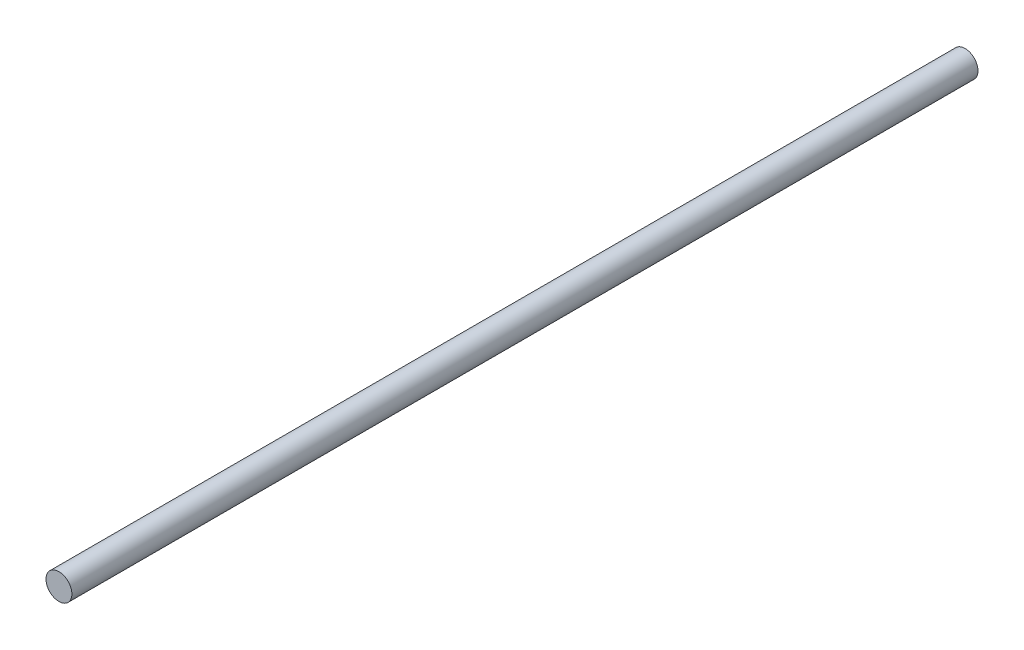
ISO-10303-21;
HEADER;
FILE_DESCRIPTION(('STEP AP214'),'2;1');
FILE_NAME('part.step','',(''),(''),'','','');
FILE_SCHEMA(('AUTOMOTIVE_DESIGN { 1 0 10303 214 1 1 1 1 }'));
ENDSEC;
DATA;
#1=APPLICATION_CONTEXT('core data for automotive mechanical design processes');
#2=APPLICATION_PROTOCOL_DEFINITION('international standard','automotive_design',2000,#1);
#3=PRODUCT_CONTEXT('',#1,'mechanical');
#4=PRODUCT('Part','Part','',(#3));
#5=PRODUCT_RELATED_PRODUCT_CATEGORY('part','',(#4));
#6=PRODUCT_DEFINITION_FORMATION('','',#4);
#7=PRODUCT_DEFINITION_CONTEXT('part definition',#1,'design');
#8=PRODUCT_DEFINITION('design','',#6,#7);
#9=PRODUCT_DEFINITION_SHAPE('','',#8);
#10=(LENGTH_UNIT() NAMED_UNIT(*) SI_UNIT(.MILLI.,.METRE.));
#11=(NAMED_UNIT(*) PLANE_ANGLE_UNIT() SI_UNIT($,.RADIAN.));
#12=(NAMED_UNIT(*) SI_UNIT($,.STERADIAN.) SOLID_ANGLE_UNIT());
#13=UNCERTAINTY_MEASURE_WITH_UNIT(LENGTH_MEASURE(1.E-05),#10,'distance_accuracy_value','');
#14=(GEOMETRIC_REPRESENTATION_CONTEXT(3) GLOBAL_UNCERTAINTY_ASSIGNED_CONTEXT((#13)) GLOBAL_UNIT_ASSIGNED_CONTEXT((#10,
#11,#12)) REPRESENTATION_CONTEXT('',''));
#15=CARTESIAN_POINT('',(0.,0.,0.));
#16=DIRECTION('',(0.,0.,1.));
#17=DIRECTION('',(1.,0.,0.));
#18=AXIS2_PLACEMENT_3D('',#15,#16,#17);
#19=CARTESIAN_POINT('',(0.,0.,140.));
#20=DIRECTION('',(0.,0.,-1.));
#21=DIRECTION('',(-1.,0.,0.));
#22=AXIS2_PLACEMENT_3D('',#19,#20,#21);
#23=CYLINDRICAL_SURFACE('',#22,2.);
#24=CARTESIAN_POINT('',(0.,0.,140.));
#25=DIRECTION('',(0.,0.,1.));
#26=DIRECTION('',(1.,0.,0.));
#27=AXIS2_PLACEMENT_3D('',#24,#25,#26);
#28=CIRCLE('',#27,2.);
#29=CARTESIAN_POINT('',(2.,0.,140.));
#30=VERTEX_POINT('',#29);
#31=EDGE_CURVE('E10',#30,#30,#28,.T.);
#32=ORIENTED_EDGE('',*,*,#31,.F.);
#33=EDGE_LOOP('',(#32));
#34=FACE_BOUND('',#33,.T.);
#35=CARTESIAN_POINT('',(0.,0.,0.));
#36=DIRECTION('',(0.,0.,1.));
#37=DIRECTION('',(1.,0.,0.));
#38=AXIS2_PLACEMENT_3D('',#35,#36,#37);
#39=CIRCLE('',#38,2.);
#40=CARTESIAN_POINT('',(2.,0.,0.));
#41=VERTEX_POINT('',#40);
#42=EDGE_CURVE('E40',#41,#41,#39,.T.);
#43=ORIENTED_EDGE('',*,*,#42,.T.);
#44=EDGE_LOOP('',(#43));
#45=FACE_BOUND('',#44,.T.);
#46=ADVANCED_FACE('F37',(#34,#45),#23,.T.);
#47=CARTESIAN_POINT('',(0.,0.,140.));
#48=DIRECTION('',(0.,0.,1.));
#49=DIRECTION('',(1.,0.,0.));
#50=AXIS2_PLACEMENT_3D('',#47,#48,#49);
#51=PLANE('',#50);
#52=ORIENTED_EDGE('',*,*,#31,.T.);
#53=EDGE_LOOP('',(#52));
#54=FACE_BOUND('',#53,.T.);
#55=ADVANCED_FACE('F54',(#54),#51,.T.);
#56=CARTESIAN_POINT('',(0.,0.,0.));
#57=DIRECTION('',(0.,0.,1.));
#58=DIRECTION('',(1.,0.,0.));
#59=AXIS2_PLACEMENT_3D('',#56,#57,#58);
#60=PLANE('',#59);
#61=ORIENTED_EDGE('',*,*,#42,.F.);
#62=EDGE_LOOP('',(#61));
#63=FACE_BOUND('',#62,.T.);
#64=ADVANCED_FACE('F52',(#63),#60,.F.);
#65=CLOSED_SHELL('',(#46,#55,#64));
#66=MANIFOLD_SOLID_BREP('B2',#65);
#67=ADVANCED_BREP_SHAPE_REPRESENTATION('',(#18,#66),#14);
#68=SHAPE_DEFINITION_REPRESENTATION(#9,#67);
ENDSEC;
END-ISO-10303-21;
